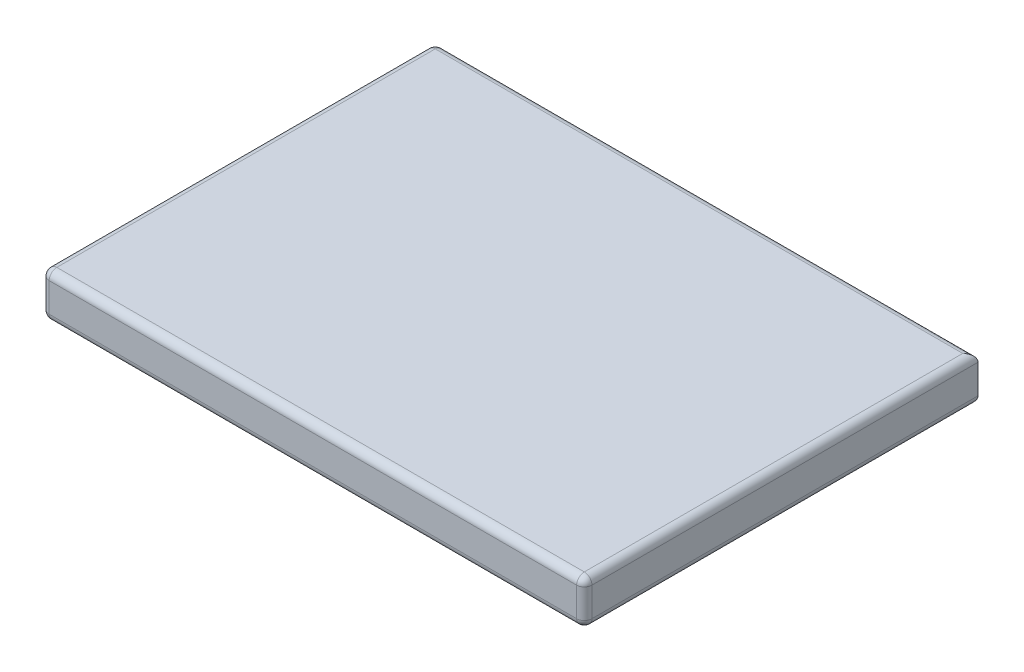
ISO-10303-21;
HEADER;
FILE_DESCRIPTION(('STEP AP214'),'2;1');
FILE_NAME('part.step','',(''),(''),'','','');
FILE_SCHEMA(('AUTOMOTIVE_DESIGN { 1 0 10303 214 1 1 1 1 }'));
ENDSEC;
DATA;
#1=APPLICATION_CONTEXT('core data for automotive mechanical design processes');
#2=APPLICATION_PROTOCOL_DEFINITION('international standard','automotive_design',2000,#1);
#3=PRODUCT_CONTEXT('',#1,'mechanical');
#4=PRODUCT('Part','Part','',(#3));
#5=PRODUCT_RELATED_PRODUCT_CATEGORY('part','',(#4));
#6=PRODUCT_DEFINITION_FORMATION('','',#4);
#7=PRODUCT_DEFINITION_CONTEXT('part definition',#1,'design');
#8=PRODUCT_DEFINITION('design','',#6,#7);
#9=PRODUCT_DEFINITION_SHAPE('','',#8);
#10=(LENGTH_UNIT() NAMED_UNIT(*) SI_UNIT(.MILLI.,.METRE.));
#11=(NAMED_UNIT(*) PLANE_ANGLE_UNIT() SI_UNIT($,.RADIAN.));
#12=(NAMED_UNIT(*) SI_UNIT($,.STERADIAN.) SOLID_ANGLE_UNIT());
#13=UNCERTAINTY_MEASURE_WITH_UNIT(LENGTH_MEASURE(1.E-05),#10,'distance_accuracy_value','');
#14=(GEOMETRIC_REPRESENTATION_CONTEXT(3) GLOBAL_UNCERTAINTY_ASSIGNED_CONTEXT((#13)) GLOBAL_UNIT_ASSIGNED_CONTEXT((#10,
#11,#12)) REPRESENTATION_CONTEXT('',''));
#15=CARTESIAN_POINT('',(0.,0.,0.));
#16=DIRECTION('',(0.,0.,1.));
#17=DIRECTION('',(1.,0.,0.));
#18=AXIS2_PLACEMENT_3D('',#15,#16,#17);
#19=CARTESIAN_POINT('',(0.,5.8,0.));
#20=DIRECTION('',(1.,0.,0.));
#21=DIRECTION('',(0.,0.,-1.));
#22=AXIS2_PLACEMENT_3D('',#19,#20,#21);
#23=PLANE('',#22);
#24=DIRECTION('',(0.,0.,1.));
#25=VECTOR('',#24,1.);
#26=CARTESIAN_POINT('',(0.,4.8,0.));
#27=LINE('',#26,#25);
#28=CARTESIAN_POINT('',(0.,4.8,-0.999999999999999));
#29=VERTEX_POINT('',#28);
#30=CARTESIAN_POINT('',(0.,4.8,-50.5));
#31=VERTEX_POINT('',#30);
#32=EDGE_CURVE('E124',#29,#31,#27,.F.);
#33=ORIENTED_EDGE('',*,*,#32,.T.);
#34=DIRECTION('',(0.,-1.,0.));
#35=VECTOR('',#34,1.);
#36=CARTESIAN_POINT('',(0.,5.8,-50.5));
#37=LINE('',#36,#35);
#38=CARTESIAN_POINT('',(0.,1.,-50.5));
#39=VERTEX_POINT('',#38);
#40=EDGE_CURVE('E120',#31,#39,#37,.T.);
#41=ORIENTED_EDGE('',*,*,#40,.T.);
#42=DIRECTION('',(0.,0.,1.));
#43=VECTOR('',#42,1.);
#44=CARTESIAN_POINT('',(0.,1.,0.));
#45=LINE('',#44,#43);
#46=CARTESIAN_POINT('',(0.,1.,-0.999999999999999));
#47=VERTEX_POINT('',#46);
#48=EDGE_CURVE('E115',#39,#47,#45,.T.);
#49=ORIENTED_EDGE('',*,*,#48,.T.);
#50=DIRECTION('',(0.,-1.,0.));
#51=VECTOR('',#50,1.);
#52=CARTESIAN_POINT('',(0.,5.8,-0.999999999999999));
#53=LINE('',#52,#51);
#54=EDGE_CURVE('E117',#47,#29,#53,.F.);
#55=ORIENTED_EDGE('',*,*,#54,.T.);
#56=EDGE_LOOP('',(#33,#41,#49,#55));
#57=FACE_BOUND('',#56,.T.);
#58=ADVANCED_FACE('F33',(#57),#23,.F.);
#59=CARTESIAN_POINT('',(0.,5.8,0.));
#60=DIRECTION('',(0.,0.,-1.));
#61=DIRECTION('',(-1.,0.,0.));
#62=AXIS2_PLACEMENT_3D('',#59,#60,#61);
#63=PLANE('',#62);
#64=DIRECTION('',(1.,0.,0.));
#65=VECTOR('',#64,1.);
#66=CARTESIAN_POINT('',(0.,4.8,0.));
#67=LINE('',#66,#65);
#68=CARTESIAN_POINT('',(70.,4.8,0.));
#69=VERTEX_POINT('',#68);
#70=CARTESIAN_POINT('',(0.999999999999999,4.8,0.));
#71=VERTEX_POINT('',#70);
#72=EDGE_CURVE('E221',#69,#71,#67,.F.);
#73=ORIENTED_EDGE('',*,*,#72,.T.);
#74=DIRECTION('',(0.,-1.,0.));
#75=VECTOR('',#74,1.);
#76=CARTESIAN_POINT('',(0.999999999999999,5.8,0.));
#77=LINE('',#76,#75);
#78=CARTESIAN_POINT('',(0.999999999999999,1.,0.));
#79=VERTEX_POINT('',#78);
#80=EDGE_CURVE('E223',#71,#79,#77,.T.);
#81=ORIENTED_EDGE('',*,*,#80,.T.);
#82=DIRECTION('',(1.,0.,0.));
#83=VECTOR('',#82,1.);
#84=CARTESIAN_POINT('',(71.,1.,0.));
#85=LINE('',#84,#83);
#86=CARTESIAN_POINT('',(70.,1.,0.));
#87=VERTEX_POINT('',#86);
#88=EDGE_CURVE('E217',#79,#87,#85,.T.);
#89=ORIENTED_EDGE('',*,*,#88,.T.);
#90=DIRECTION('',(0.,-1.,0.));
#91=VECTOR('',#90,1.);
#92=CARTESIAN_POINT('',(70.,5.8,0.));
#93=LINE('',#92,#91);
#94=EDGE_CURVE('E219',#87,#69,#93,.F.);
#95=ORIENTED_EDGE('',*,*,#94,.T.);
#96=EDGE_LOOP('',(#73,#81,#89,#95));
#97=FACE_BOUND('',#96,.T.);
#98=ADVANCED_FACE('F271',(#97),#63,.F.);
#99=CARTESIAN_POINT('',(71.,5.8,0.));
#100=DIRECTION('',(-1.,0.,0.));
#101=DIRECTION('',(0.,0.,1.));
#102=AXIS2_PLACEMENT_3D('',#99,#100,#101);
#103=PLANE('',#102);
#104=DIRECTION('',(0.,-1.,0.));
#105=VECTOR('',#104,1.);
#106=CARTESIAN_POINT('',(71.,5.8,-1.));
#107=LINE('',#106,#105);
#108=CARTESIAN_POINT('',(71.,4.8,-1.));
#109=VERTEX_POINT('',#108);
#110=CARTESIAN_POINT('',(71.,1.,-1.));
#111=VERTEX_POINT('',#110);
#112=EDGE_CURVE('E42',#109,#111,#107,.T.);
#113=ORIENTED_EDGE('',*,*,#112,.T.);
#114=DIRECTION('',(0.,0.,-1.));
#115=VECTOR('',#114,1.);
#116=CARTESIAN_POINT('',(70.9999999999999,1.,-51.5));
#117=LINE('',#116,#115);
#118=CARTESIAN_POINT('',(70.9999999999999,1.,-51.5));
#119=VERTEX_POINT('',#118);
#120=EDGE_CURVE('E11',#111,#119,#117,.T.);
#121=ORIENTED_EDGE('',*,*,#120,.T.);
#122=DIRECTION('',(0.,-1.,0.));
#123=VECTOR('',#122,1.);
#124=CARTESIAN_POINT('',(70.9999999999999,5.8,-51.5));
#125=LINE('',#124,#123);
#126=CARTESIAN_POINT('',(70.9999999999999,4.8,-51.5));
#127=VERTEX_POINT('',#126);
#128=EDGE_CURVE('E136',#127,#119,#125,.T.);
#129=ORIENTED_EDGE('',*,*,#128,.F.);
#130=DIRECTION('',(0.,0.,-1.));
#131=VECTOR('',#130,1.);
#132=CARTESIAN_POINT('',(71.,4.8,0.));
#133=LINE('',#132,#131);
#134=EDGE_CURVE('E53',#127,#109,#133,.F.);
#135=ORIENTED_EDGE('',*,*,#134,.T.);
#136=EDGE_LOOP('',(#113,#121,#129,#135));
#137=FACE_BOUND('',#136,.T.);
#138=ADVANCED_FACE('F298',(#137),#103,.F.);
#139=CARTESIAN_POINT('',(0.,5.8,-51.5));
#140=DIRECTION('',(0.,0.,1.));
#141=DIRECTION('',(1.,0.,0.));
#142=AXIS2_PLACEMENT_3D('',#139,#140,#141);
#143=PLANE('',#142);
#144=ORIENTED_EDGE('',*,*,#128,.T.);
#145=DIRECTION('',(-1.,0.,0.));
#146=VECTOR('',#145,1.);
#147=CARTESIAN_POINT('',(0.,1.,-51.5));
#148=LINE('',#147,#146);
#149=CARTESIAN_POINT('',(0.999999999999932,1.,-51.5));
#150=VERTEX_POINT('',#149);
#151=EDGE_CURVE('E199',#119,#150,#148,.T.);
#152=ORIENTED_EDGE('',*,*,#151,.T.);
#153=DIRECTION('',(0.,-1.,0.));
#154=VECTOR('',#153,1.);
#155=CARTESIAN_POINT('',(0.999999999999932,5.8,-51.5));
#156=LINE('',#155,#154);
#157=CARTESIAN_POINT('',(0.999999999999932,4.8,-51.5));
#158=VERTEX_POINT('',#157);
#159=EDGE_CURVE('E196',#150,#158,#156,.F.);
#160=ORIENTED_EDGE('',*,*,#159,.T.);
#161=DIRECTION('',(-1.,0.,0.));
#162=VECTOR('',#161,1.);
#163=CARTESIAN_POINT('',(0.,4.8,-51.5));
#164=LINE('',#163,#162);
#165=EDGE_CURVE('E194',#158,#127,#164,.F.);
#166=ORIENTED_EDGE('',*,*,#165,.T.);
#167=EDGE_LOOP('',(#144,#152,#160,#166));
#168=FACE_BOUND('',#167,.T.);
#169=ADVANCED_FACE('F251',(#168),#143,.F.);
#170=CARTESIAN_POINT('',(0.,5.8,0.));
#171=DIRECTION('',(0.,-1.,0.));
#172=DIRECTION('',(0.,0.,-1.));
#173=AXIS2_PLACEMENT_3D('',#170,#171,#172);
#174=PLANE('',#173);
#175=DIRECTION('',(-1.,0.,0.));
#176=VECTOR('',#175,1.);
#177=CARTESIAN_POINT('',(0.,5.8,-50.5));
#178=LINE('',#177,#176);
#179=CARTESIAN_POINT('',(69.9999999999999,5.8,-50.5));
#180=VERTEX_POINT('',#179);
#181=CARTESIAN_POINT('',(0.999999999999932,5.8,-50.5));
#182=VERTEX_POINT('',#181);
#183=EDGE_CURVE('E201',#180,#182,#178,.T.);
#184=ORIENTED_EDGE('',*,*,#183,.T.);
#185=DIRECTION('',(0.,0.,1.));
#186=VECTOR('',#185,1.);
#187=CARTESIAN_POINT('',(1.,5.8,0.));
#188=LINE('',#187,#186);
#189=CARTESIAN_POINT('',(0.999999999999999,5.8,-1.));
#190=VERTEX_POINT('',#189);
#191=EDGE_CURVE('E207',#182,#190,#188,.T.);
#192=ORIENTED_EDGE('',*,*,#191,.T.);
#193=DIRECTION('',(1.,0.,0.));
#194=VECTOR('',#193,1.);
#195=CARTESIAN_POINT('',(0.,5.8,-1.));
#196=LINE('',#195,#194);
#197=CARTESIAN_POINT('',(70.,5.8,-1.));
#198=VERTEX_POINT('',#197);
#199=EDGE_CURVE('E205',#190,#198,#196,.T.);
#200=ORIENTED_EDGE('',*,*,#199,.T.);
#201=DIRECTION('',(0.,0.,-1.));
#202=VECTOR('',#201,1.);
#203=CARTESIAN_POINT('',(70.,5.8,0.));
#204=LINE('',#203,#202);
#205=EDGE_CURVE('E203',#198,#180,#204,.T.);
#206=ORIENTED_EDGE('',*,*,#205,.T.);
#207=EDGE_LOOP('',(#184,#192,#200,#206));
#208=FACE_BOUND('',#207,.T.);
#209=ADVANCED_FACE('F281',(#208),#174,.F.);
#210=CARTESIAN_POINT('',(0.,0.,0.));
#211=DIRECTION('',(0.,-1.,0.));
#212=DIRECTION('',(0.,0.,-1.));
#213=AXIS2_PLACEMENT_3D('',#210,#211,#212);
#214=PLANE('',#213);
#215=DIRECTION('',(1.,0.,0.));
#216=VECTOR('',#215,1.);
#217=CARTESIAN_POINT('',(0.,0.,-1.));
#218=LINE('',#217,#216);
#219=CARTESIAN_POINT('',(70.,0.,-1.));
#220=VERTEX_POINT('',#219);
#221=CARTESIAN_POINT('',(0.999999999999999,0.,-1.));
#222=VERTEX_POINT('',#221);
#223=EDGE_CURVE('E214',#220,#222,#218,.F.);
#224=ORIENTED_EDGE('',*,*,#223,.T.);
#225=DIRECTION('',(0.,0.,1.));
#226=VECTOR('',#225,1.);
#227=CARTESIAN_POINT('',(0.999999999999931,0.,-51.5));
#228=LINE('',#227,#226);
#229=CARTESIAN_POINT('',(0.999999999999932,0.,-50.5));
#230=VERTEX_POINT('',#229);
#231=EDGE_CURVE('E148',#222,#230,#228,.F.);
#232=ORIENTED_EDGE('',*,*,#231,.T.);
#233=DIRECTION('',(-1.,0.,0.));
#234=VECTOR('',#233,1.);
#235=CARTESIAN_POINT('',(70.9999999999999,0.,-50.5));
#236=LINE('',#235,#234);
#237=CARTESIAN_POINT('',(69.9999999999999,0.,-50.5));
#238=VERTEX_POINT('',#237);
#239=EDGE_CURVE('E210',#230,#238,#236,.F.);
#240=ORIENTED_EDGE('',*,*,#239,.T.);
#241=DIRECTION('',(0.,0.,-1.));
#242=VECTOR('',#241,1.);
#243=CARTESIAN_POINT('',(70.,0.,0.));
#244=LINE('',#243,#242);
#245=EDGE_CURVE('E212',#238,#220,#244,.F.);
#246=ORIENTED_EDGE('',*,*,#245,.T.);
#247=EDGE_LOOP('',(#224,#232,#240,#246));
#248=FACE_BOUND('',#247,.T.);
#249=ADVANCED_FACE('F264',(#248),#214,.T.);
#250=CARTESIAN_POINT('',(70.,5.8,-1.));
#251=DIRECTION('',(0.,-1.,0.));
#252=DIRECTION('',(0.,0.,-1.));
#253=AXIS2_PLACEMENT_3D('',#250,#251,#252);
#254=CYLINDRICAL_SURFACE('',#253,1.);
#255=CARTESIAN_POINT('',(70.,4.8,-1.));
#256=DIRECTION('',(0.,1.,0.));
#257=DIRECTION('',(0.,0.,1.));
#258=AXIS2_PLACEMENT_3D('',#255,#256,#257);
#259=CIRCLE('',#258,1.);
#260=EDGE_CURVE('E37',#69,#109,#259,.T.);
#261=ORIENTED_EDGE('',*,*,#260,.F.);
#262=ORIENTED_EDGE('',*,*,#94,.F.);
#263=CARTESIAN_POINT('',(70.,1.,-1.));
#264=DIRECTION('',(0.,-1.,0.));
#265=DIRECTION('',(0.,0.,-1.));
#266=AXIS2_PLACEMENT_3D('',#263,#264,#265);
#267=CIRCLE('',#266,1.);
#268=EDGE_CURVE('E172',#111,#87,#267,.T.);
#269=ORIENTED_EDGE('',*,*,#268,.F.);
#270=ORIENTED_EDGE('',*,*,#112,.F.);
#271=EDGE_LOOP('',(#261,#262,#269,#270));
#272=FACE_BOUND('',#271,.T.);
#273=ADVANCED_FACE('F35',(#272),#254,.T.);
#274=CARTESIAN_POINT('',(70.,4.8,-1.));
#275=DIRECTION('',(0.,0.,1.));
#276=DIRECTION('',(1.,0.,0.));
#277=AXIS2_PLACEMENT_3D('',#274,#275,#276);
#278=SPHERICAL_SURFACE('',#277,1.);
#279=CARTESIAN_POINT('',(70.,4.8,-1.));
#280=DIRECTION('',(0.,0.,1.));
#281=DIRECTION('',(1.,0.,0.));
#282=AXIS2_PLACEMENT_3D('',#279,#280,#281);
#283=CIRCLE('',#282,1.);
#284=EDGE_CURVE('E169',#198,#109,#283,.F.);
#285=ORIENTED_EDGE('',*,*,#284,.F.);
#286=CARTESIAN_POINT('',(70.,4.8,-1.));
#287=DIRECTION('',(1.,0.,0.));
#288=DIRECTION('',(0.,0.,-1.));
#289=AXIS2_PLACEMENT_3D('',#286,#287,#288);
#290=CIRCLE('',#289,1.);
#291=EDGE_CURVE('E177',#69,#198,#290,.F.);
#292=ORIENTED_EDGE('',*,*,#291,.F.);
#293=ORIENTED_EDGE('',*,*,#260,.T.);
#294=EDGE_LOOP('',(#285,#292,#293));
#295=FACE_BOUND('',#294,.T.);
#296=ADVANCED_FACE('F285',(#295),#278,.T.);
#297=CARTESIAN_POINT('',(0.,4.8,-1.));
#298=DIRECTION('',(1.,0.,0.));
#299=DIRECTION('',(0.,0.,-1.));
#300=AXIS2_PLACEMENT_3D('',#297,#298,#299);
#301=CYLINDRICAL_SURFACE('',#300,1.);
#302=ORIENTED_EDGE('',*,*,#291,.T.);
#303=ORIENTED_EDGE('',*,*,#199,.F.);
#304=CARTESIAN_POINT('',(0.999999999999999,4.8,-1.));
#305=DIRECTION('',(-1.,0.,0.));
#306=DIRECTION('',(0.,0.,1.));
#307=AXIS2_PLACEMENT_3D('',#304,#305,#306);
#308=CIRCLE('',#307,1.);
#309=EDGE_CURVE('E166',#71,#190,#308,.T.);
#310=ORIENTED_EDGE('',*,*,#309,.F.);
#311=ORIENTED_EDGE('',*,*,#72,.F.);
#312=EDGE_LOOP('',(#302,#303,#310,#311));
#313=FACE_BOUND('',#312,.T.);
#314=ADVANCED_FACE('F273',(#313),#301,.T.);
#315=CARTESIAN_POINT('',(0.999999999999999,5.8,-1.));
#316=DIRECTION('',(0.,-1.,0.));
#317=DIRECTION('',(0.,0.,-1.));
#318=AXIS2_PLACEMENT_3D('',#315,#316,#317);
#319=CYLINDRICAL_SURFACE('',#318,1.);
#320=CARTESIAN_POINT('',(0.999999999999999,1.,-1.));
#321=DIRECTION('',(0.,-1.,0.));
#322=DIRECTION('',(0.,0.,-1.));
#323=AXIS2_PLACEMENT_3D('',#320,#321,#322);
#324=CIRCLE('',#323,1.);
#325=EDGE_CURVE('E131',#79,#47,#324,.T.);
#326=ORIENTED_EDGE('',*,*,#325,.F.);
#327=ORIENTED_EDGE('',*,*,#80,.F.);
#328=CARTESIAN_POINT('',(0.999999999999999,4.8,-1.));
#329=DIRECTION('',(0.,1.,0.));
#330=DIRECTION('',(0.,0.,1.));
#331=AXIS2_PLACEMENT_3D('',#328,#329,#330);
#332=CIRCLE('',#331,1.);
#333=EDGE_CURVE('E134',#29,#71,#332,.T.);
#334=ORIENTED_EDGE('',*,*,#333,.F.);
#335=ORIENTED_EDGE('',*,*,#54,.F.);
#336=EDGE_LOOP('',(#326,#327,#334,#335));
#337=FACE_BOUND('',#336,.T.);
#338=ADVANCED_FACE('F129',(#337),#319,.T.);
#339=CARTESIAN_POINT('',(0.,1.,-1.));
#340=DIRECTION('',(-1.,0.,0.));
#341=DIRECTION('',(0.,0.,1.));
#342=AXIS2_PLACEMENT_3D('',#339,#340,#341);
#343=CYLINDRICAL_SURFACE('',#342,1.);
#344=CARTESIAN_POINT('',(70.,1.,-1.));
#345=DIRECTION('',(1.,0.,0.));
#346=DIRECTION('',(0.,0.,-1.));
#347=AXIS2_PLACEMENT_3D('',#344,#345,#346);
#348=CIRCLE('',#347,1.);
#349=EDGE_CURVE('E175',#87,#220,#348,.T.);
#350=ORIENTED_EDGE('',*,*,#349,.F.);
#351=ORIENTED_EDGE('',*,*,#88,.F.);
#352=CARTESIAN_POINT('',(0.999999999999999,1.,-1.));
#353=DIRECTION('',(-1.,0.,0.));
#354=DIRECTION('',(0.,0.,1.));
#355=AXIS2_PLACEMENT_3D('',#352,#353,#354);
#356=CIRCLE('',#355,1.);
#357=EDGE_CURVE('E144',#222,#79,#356,.T.);
#358=ORIENTED_EDGE('',*,*,#357,.F.);
#359=ORIENTED_EDGE('',*,*,#223,.F.);
#360=EDGE_LOOP('',(#350,#351,#358,#359));
#361=FACE_BOUND('',#360,.T.);
#362=ADVANCED_FACE('F268',(#361),#343,.T.);
#363=CARTESIAN_POINT('',(70.,1.,-1.));
#364=DIRECTION('',(0.,0.,1.));
#365=DIRECTION('',(1.,0.,0.));
#366=AXIS2_PLACEMENT_3D('',#363,#364,#365);
#367=SPHERICAL_SURFACE('',#366,1.);
#368=ORIENTED_EDGE('',*,*,#268,.T.);
#369=ORIENTED_EDGE('',*,*,#349,.T.);
#370=CARTESIAN_POINT('',(70.,1.,-1.));
#371=DIRECTION('',(0.,0.,1.));
#372=DIRECTION('',(1.,0.,0.));
#373=AXIS2_PLACEMENT_3D('',#370,#371,#372);
#374=CIRCLE('',#373,1.);
#375=EDGE_CURVE('E161',#111,#220,#374,.F.);
#376=ORIENTED_EDGE('',*,*,#375,.F.);
#377=EDGE_LOOP('',(#368,#369,#376));
#378=FACE_BOUND('',#377,.T.);
#379=ADVANCED_FACE('F326',(#378),#367,.T.);
#380=CARTESIAN_POINT('',(70.,4.8,0.));
#381=DIRECTION('',(0.,0.,-1.));
#382=DIRECTION('',(-1.,0.,0.));
#383=AXIS2_PLACEMENT_3D('',#380,#381,#382);
#384=CYLINDRICAL_SURFACE('',#383,1.);
#385=ORIENTED_EDGE('',*,*,#284,.T.);
#386=ORIENTED_EDGE('',*,*,#134,.F.);
#387=CARTESIAN_POINT('',(69.9999999999999,4.8,-50.5));
#388=DIRECTION('',(-0.707106781186548,0.,-0.707106781186547));
#389=DIRECTION('',(-0.707106781186547,0.,0.707106781186548));
#390=AXIS2_PLACEMENT_3D('',#387,#388,#389);
#391=ELLIPSE('',#390,1.41421356237309,1.);
#392=EDGE_CURVE('E152',#180,#127,#391,.T.);
#393=ORIENTED_EDGE('',*,*,#392,.F.);
#394=ORIENTED_EDGE('',*,*,#205,.F.);
#395=EDGE_LOOP('',(#385,#386,#393,#394));
#396=FACE_BOUND('',#395,.T.);
#397=ADVANCED_FACE('F284',(#396),#384,.T.);
#398=CARTESIAN_POINT('',(0.999999999999999,4.8,-1.));
#399=DIRECTION('',(0.,0.,1.));
#400=DIRECTION('',(1.,0.,0.));
#401=AXIS2_PLACEMENT_3D('',#398,#399,#400);
#402=SPHERICAL_SURFACE('',#401,1.);
#403=ORIENTED_EDGE('',*,*,#333,.T.);
#404=ORIENTED_EDGE('',*,*,#309,.T.);
#405=CARTESIAN_POINT('',(0.999999999999999,4.8,-1.));
#406=DIRECTION('',(0.,0.,1.));
#407=DIRECTION('',(1.,0.,0.));
#408=AXIS2_PLACEMENT_3D('',#405,#406,#407);
#409=CIRCLE('',#408,1.);
#410=EDGE_CURVE('E149',#29,#190,#409,.F.);
#411=ORIENTED_EDGE('',*,*,#410,.F.);
#412=EDGE_LOOP('',(#403,#404,#411));
#413=FACE_BOUND('',#412,.T.);
#414=ADVANCED_FACE('F275',(#413),#402,.T.);
#415=CARTESIAN_POINT('',(0.999999999999999,1.,-1.));
#416=DIRECTION('',(0.,0.,1.));
#417=DIRECTION('',(1.,0.,0.));
#418=AXIS2_PLACEMENT_3D('',#415,#416,#417);
#419=SPHERICAL_SURFACE('',#418,1.);
#420=ORIENTED_EDGE('',*,*,#357,.T.);
#421=ORIENTED_EDGE('',*,*,#325,.T.);
#422=CARTESIAN_POINT('',(0.999999999999999,1.,-1.));
#423=DIRECTION('',(0.,0.,1.));
#424=DIRECTION('',(1.,0.,0.));
#425=AXIS2_PLACEMENT_3D('',#422,#423,#424);
#426=CIRCLE('',#425,1.);
#427=EDGE_CURVE('E141',#222,#47,#426,.F.);
#428=ORIENTED_EDGE('',*,*,#427,.F.);
#429=EDGE_LOOP('',(#420,#421,#428));
#430=FACE_BOUND('',#429,.T.);
#431=ADVANCED_FACE('F140',(#430),#419,.T.);
#432=CARTESIAN_POINT('',(70.,1.,0.));
#433=DIRECTION('',(0.,0.,1.));
#434=DIRECTION('',(1.,0.,0.));
#435=AXIS2_PLACEMENT_3D('',#432,#433,#434);
#436=CYLINDRICAL_SURFACE('',#435,1.);
#437=ORIENTED_EDGE('',*,*,#375,.T.);
#438=ORIENTED_EDGE('',*,*,#245,.F.);
#439=CARTESIAN_POINT('',(69.9999999999999,1.,-50.5));
#440=DIRECTION('',(0.707106781186548,0.,0.707106781186547));
#441=DIRECTION('',(0.707106781186547,0.,-0.707106781186548));
#442=AXIS2_PLACEMENT_3D('',#439,#440,#441);
#443=ELLIPSE('',#442,1.41421356237309,1.);
#444=EDGE_CURVE('E150',#119,#238,#443,.F.);
#445=ORIENTED_EDGE('',*,*,#444,.F.);
#446=ORIENTED_EDGE('',*,*,#120,.F.);
#447=EDGE_LOOP('',(#437,#438,#445,#446));
#448=FACE_BOUND('',#447,.T.);
#449=ADVANCED_FACE('F316',(#448),#436,.T.);
#450=CARTESIAN_POINT('',(0.,4.8,-50.5));
#451=DIRECTION('',(-1.,0.,0.));
#452=DIRECTION('',(0.,0.,1.));
#453=AXIS2_PLACEMENT_3D('',#450,#451,#452);
#454=CYLINDRICAL_SURFACE('',#453,1.);
#455=ORIENTED_EDGE('',*,*,#392,.T.);
#456=ORIENTED_EDGE('',*,*,#165,.F.);
#457=CARTESIAN_POINT('',(0.999999999999932,4.8,-50.5));
#458=DIRECTION('',(-1.,0.,0.));
#459=DIRECTION('',(0.,0.,1.));
#460=AXIS2_PLACEMENT_3D('',#457,#458,#459);
#461=CIRCLE('',#460,1.);
#462=EDGE_CURVE('E155',#182,#158,#461,.T.);
#463=ORIENTED_EDGE('',*,*,#462,.F.);
#464=ORIENTED_EDGE('',*,*,#183,.F.);
#465=EDGE_LOOP('',(#455,#456,#463,#464));
#466=FACE_BOUND('',#465,.T.);
#467=ADVANCED_FACE('F248',(#466),#454,.T.);
#468=CARTESIAN_POINT('',(1.,4.8,0.));
#469=DIRECTION('',(0.,0.,1.));
#470=DIRECTION('',(1.,0.,0.));
#471=AXIS2_PLACEMENT_3D('',#468,#469,#470);
#472=CYLINDRICAL_SURFACE('',#471,1.);
#473=ORIENTED_EDGE('',*,*,#410,.T.);
#474=ORIENTED_EDGE('',*,*,#191,.F.);
#475=CARTESIAN_POINT('',(0.999999999999932,4.8,-50.5));
#476=DIRECTION('',(0.,0.,-1.));
#477=DIRECTION('',(-1.,0.,0.));
#478=AXIS2_PLACEMENT_3D('',#475,#476,#477);
#479=CIRCLE('',#478,1.);
#480=EDGE_CURVE('E237',#31,#182,#479,.T.);
#481=ORIENTED_EDGE('',*,*,#480,.F.);
#482=ORIENTED_EDGE('',*,*,#32,.F.);
#483=EDGE_LOOP('',(#473,#474,#481,#482));
#484=FACE_BOUND('',#483,.T.);
#485=ADVANCED_FACE('F279',(#484),#472,.T.);
#486=CARTESIAN_POINT('',(1.,1.,0.));
#487=DIRECTION('',(0.,0.,-1.));
#488=DIRECTION('',(-1.,0.,0.));
#489=AXIS2_PLACEMENT_3D('',#486,#487,#488);
#490=CYLINDRICAL_SURFACE('',#489,1.);
#491=ORIENTED_EDGE('',*,*,#427,.T.);
#492=ORIENTED_EDGE('',*,*,#48,.F.);
#493=CARTESIAN_POINT('',(0.999999999999932,1.,-50.5));
#494=DIRECTION('',(0.,0.,-1.));
#495=DIRECTION('',(-1.,0.,0.));
#496=AXIS2_PLACEMENT_3D('',#493,#494,#495);
#497=CIRCLE('',#496,1.);
#498=EDGE_CURVE('E234',#230,#39,#497,.T.);
#499=ORIENTED_EDGE('',*,*,#498,.F.);
#500=ORIENTED_EDGE('',*,*,#231,.F.);
#501=EDGE_LOOP('',(#491,#492,#499,#500));
#502=FACE_BOUND('',#501,.T.);
#503=ADVANCED_FACE('F146',(#502),#490,.T.);
#504=CARTESIAN_POINT('',(0.,1.,-50.5));
#505=DIRECTION('',(1.,0.,0.));
#506=DIRECTION('',(0.,0.,-1.));
#507=AXIS2_PLACEMENT_3D('',#504,#505,#506);
#508=CYLINDRICAL_SURFACE('',#507,1.);
#509=ORIENTED_EDGE('',*,*,#444,.T.);
#510=ORIENTED_EDGE('',*,*,#239,.F.);
#511=CARTESIAN_POINT('',(0.999999999999932,1.,-50.5));
#512=DIRECTION('',(-1.,0.,0.));
#513=DIRECTION('',(0.,0.,1.));
#514=AXIS2_PLACEMENT_3D('',#511,#512,#513);
#515=CIRCLE('',#514,1.);
#516=EDGE_CURVE('E232',#150,#230,#515,.T.);
#517=ORIENTED_EDGE('',*,*,#516,.F.);
#518=ORIENTED_EDGE('',*,*,#151,.F.);
#519=EDGE_LOOP('',(#509,#510,#517,#518));
#520=FACE_BOUND('',#519,.T.);
#521=ADVANCED_FACE('F261',(#520),#508,.T.);
#522=CARTESIAN_POINT('',(0.999999999999932,4.8,-50.5));
#523=DIRECTION('',(0.,0.,1.));
#524=DIRECTION('',(1.,0.,0.));
#525=AXIS2_PLACEMENT_3D('',#522,#523,#524);
#526=SPHERICAL_SURFACE('',#525,1.);
#527=ORIENTED_EDGE('',*,*,#480,.T.);
#528=ORIENTED_EDGE('',*,*,#462,.T.);
#529=CARTESIAN_POINT('',(0.999999999999932,4.8,-50.5));
#530=DIRECTION('',(0.,1.,0.));
#531=DIRECTION('',(0.,0.,1.));
#532=AXIS2_PLACEMENT_3D('',#529,#530,#531);
#533=CIRCLE('',#532,1.);
#534=EDGE_CURVE('E230',#31,#158,#533,.F.);
#535=ORIENTED_EDGE('',*,*,#534,.F.);
#536=EDGE_LOOP('',(#527,#528,#535));
#537=FACE_BOUND('',#536,.T.);
#538=ADVANCED_FACE('F244',(#537),#526,.T.);
#539=CARTESIAN_POINT('',(0.999999999999932,1.,-50.5));
#540=DIRECTION('',(0.,0.,1.));
#541=DIRECTION('',(1.,0.,0.));
#542=AXIS2_PLACEMENT_3D('',#539,#540,#541);
#543=SPHERICAL_SURFACE('',#542,1.);
#544=ORIENTED_EDGE('',*,*,#516,.T.);
#545=ORIENTED_EDGE('',*,*,#498,.T.);
#546=CARTESIAN_POINT('',(0.999999999999932,1.,-50.5));
#547=DIRECTION('',(0.,-1.,0.));
#548=DIRECTION('',(0.,0.,-1.));
#549=AXIS2_PLACEMENT_3D('',#546,#547,#548);
#550=CIRCLE('',#549,1.);
#551=EDGE_CURVE('E228',#150,#39,#550,.F.);
#552=ORIENTED_EDGE('',*,*,#551,.F.);
#553=EDGE_LOOP('',(#544,#545,#552));
#554=FACE_BOUND('',#553,.T.);
#555=ADVANCED_FACE('F258',(#554),#543,.T.);
#556=CARTESIAN_POINT('',(0.999999999999932,5.8,-50.5));
#557=DIRECTION('',(0.,-1.,0.));
#558=DIRECTION('',(0.,0.,-1.));
#559=AXIS2_PLACEMENT_3D('',#556,#557,#558);
#560=CYLINDRICAL_SURFACE('',#559,1.);
#561=ORIENTED_EDGE('',*,*,#534,.T.);
#562=ORIENTED_EDGE('',*,*,#159,.F.);
#563=ORIENTED_EDGE('',*,*,#551,.T.);
#564=ORIENTED_EDGE('',*,*,#40,.F.);
#565=EDGE_LOOP('',(#561,#562,#563,#564));
#566=FACE_BOUND('',#565,.T.);
#567=ADVANCED_FACE('F256',(#566),#560,.T.);
#568=CLOSED_SHELL('',(#58,#98,#138,#169,#209,#249,#273,#296,#314,#338,#362,#379,#397,#414,#431,
#449,#467,#485,#503,#521,#538,#555,#567));
#569=MANIFOLD_SOLID_BREP('B2',#568);
#570=ADVANCED_BREP_SHAPE_REPRESENTATION('',(#18,#569),#14);
#571=SHAPE_DEFINITION_REPRESENTATION(#9,#570);
ENDSEC;
END-ISO-10303-21;
